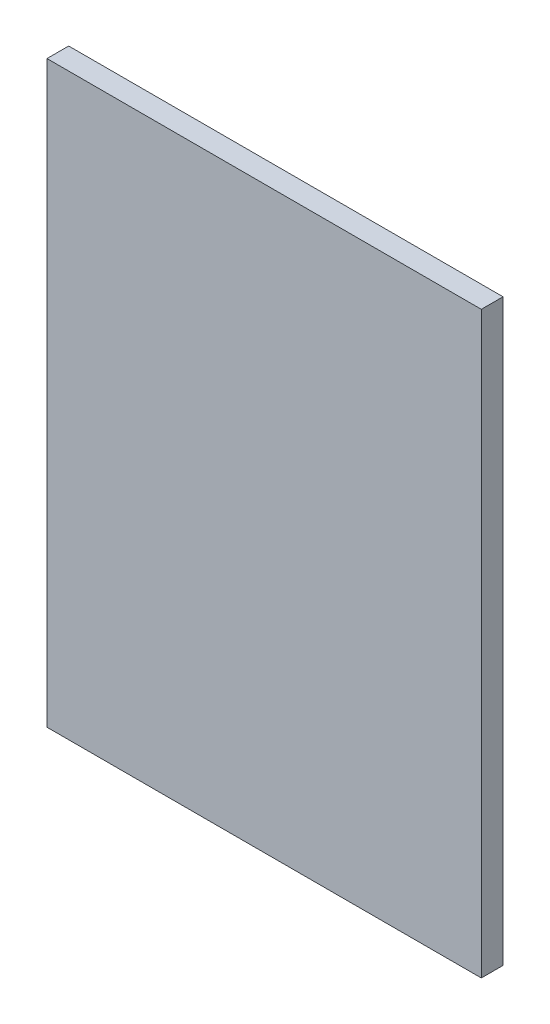
ISO-10303-21;
HEADER;
FILE_DESCRIPTION(('STEP AP214'),'2;1');
FILE_NAME('part.step','',(''),(''),'','','');
FILE_SCHEMA(('AUTOMOTIVE_DESIGN { 1 0 10303 214 1 1 1 1 }'));
ENDSEC;
DATA;
#1=APPLICATION_CONTEXT('core data for automotive mechanical design processes');
#2=APPLICATION_PROTOCOL_DEFINITION('international standard','automotive_design',2000,#1);
#3=PRODUCT_CONTEXT('',#1,'mechanical');
#4=PRODUCT('Part','Part','',(#3));
#5=PRODUCT_RELATED_PRODUCT_CATEGORY('part','',(#4));
#6=PRODUCT_DEFINITION_FORMATION('','',#4);
#7=PRODUCT_DEFINITION_CONTEXT('part definition',#1,'design');
#8=PRODUCT_DEFINITION('design','',#6,#7);
#9=PRODUCT_DEFINITION_SHAPE('','',#8);
#10=(LENGTH_UNIT() NAMED_UNIT(*) SI_UNIT(.MILLI.,.METRE.));
#11=(NAMED_UNIT(*) PLANE_ANGLE_UNIT() SI_UNIT($,.RADIAN.));
#12=(NAMED_UNIT(*) SI_UNIT($,.STERADIAN.) SOLID_ANGLE_UNIT());
#13=UNCERTAINTY_MEASURE_WITH_UNIT(LENGTH_MEASURE(1.E-05),#10,'distance_accuracy_value','');
#14=(GEOMETRIC_REPRESENTATION_CONTEXT(3) GLOBAL_UNCERTAINTY_ASSIGNED_CONTEXT((#13)) GLOBAL_UNIT_ASSIGNED_CONTEXT((#10,
#11,#12)) REPRESENTATION_CONTEXT('',''));
#15=CARTESIAN_POINT('',(0.,0.,0.));
#16=DIRECTION('',(0.,0.,1.));
#17=DIRECTION('',(1.,0.,0.));
#18=AXIS2_PLACEMENT_3D('',#15,#16,#17);
#19=CARTESIAN_POINT('',(0.,0.,3.));
#20=DIRECTION('',(1.,0.,0.));
#21=DIRECTION('',(0.,1.,0.));
#22=AXIS2_PLACEMENT_3D('',#19,#20,#21);
#23=PLANE('',#22);
#24=DIRECTION('',(0.,-1.,0.));
#25=VECTOR('',#24,1.);
#26=CARTESIAN_POINT('',(0.,0.,0.));
#27=LINE('',#26,#25);
#28=CARTESIAN_POINT('',(0.,0.,0.));
#29=VERTEX_POINT('',#28);
#30=CARTESIAN_POINT('',(0.,-80.,0.));
#31=VERTEX_POINT('',#30);
#32=EDGE_CURVE('E111',#29,#31,#27,.T.);
#33=ORIENTED_EDGE('',*,*,#32,.T.);
#34=DIRECTION('',(0.,0.,-1.));
#35=VECTOR('',#34,1.);
#36=CARTESIAN_POINT('',(0.,-80.,3.));
#37=LINE('',#36,#35);
#38=CARTESIAN_POINT('',(0.,-80.,3.));
#39=VERTEX_POINT('',#38);
#40=EDGE_CURVE('E11',#39,#31,#37,.T.);
#41=ORIENTED_EDGE('',*,*,#40,.F.);
#42=DIRECTION('',(0.,-1.,0.));
#43=VECTOR('',#42,1.);
#44=CARTESIAN_POINT('',(0.,0.,3.));
#45=LINE('',#44,#43);
#46=CARTESIAN_POINT('',(0.,0.,3.));
#47=VERTEX_POINT('',#46);
#48=EDGE_CURVE('E95',#47,#39,#45,.T.);
#49=ORIENTED_EDGE('',*,*,#48,.F.);
#50=DIRECTION('',(0.,0.,-1.));
#51=VECTOR('',#50,1.);
#52=CARTESIAN_POINT('',(0.,0.,3.));
#53=LINE('',#52,#51);
#54=EDGE_CURVE('E107',#47,#29,#53,.T.);
#55=ORIENTED_EDGE('',*,*,#54,.T.);
#56=EDGE_LOOP('',(#33,#41,#49,#55));
#57=FACE_BOUND('',#56,.T.);
#58=ADVANCED_FACE('F43',(#57),#23,.F.);
#59=CARTESIAN_POINT('',(0.,-80.,3.));
#60=DIRECTION('',(0.,1.,0.));
#61=DIRECTION('',(0.,0.,1.));
#62=AXIS2_PLACEMENT_3D('',#59,#60,#61);
#63=PLANE('',#62);
#64=DIRECTION('',(1.,0.,0.));
#65=VECTOR('',#64,1.);
#66=CARTESIAN_POINT('',(0.,-80.,0.));
#67=LINE('',#66,#65);
#68=CARTESIAN_POINT('',(60.,-80.,0.));
#69=VERTEX_POINT('',#68);
#70=EDGE_CURVE('E100',#31,#69,#67,.T.);
#71=ORIENTED_EDGE('',*,*,#70,.T.);
#72=DIRECTION('',(0.,0.,-1.));
#73=VECTOR('',#72,1.);
#74=CARTESIAN_POINT('',(60.,-80.,3.));
#75=LINE('',#74,#73);
#76=CARTESIAN_POINT('',(60.,-80.,3.));
#77=VERTEX_POINT('',#76);
#78=EDGE_CURVE('E52',#77,#69,#75,.T.);
#79=ORIENTED_EDGE('',*,*,#78,.F.);
#80=DIRECTION('',(1.,0.,0.));
#81=VECTOR('',#80,1.);
#82=CARTESIAN_POINT('',(0.,-80.,3.));
#83=LINE('',#82,#81);
#84=EDGE_CURVE('E90',#39,#77,#83,.T.);
#85=ORIENTED_EDGE('',*,*,#84,.F.);
#86=ORIENTED_EDGE('',*,*,#40,.T.);
#87=EDGE_LOOP('',(#71,#79,#85,#86));
#88=FACE_BOUND('',#87,.T.);
#89=ADVANCED_FACE('F99',(#88),#63,.F.);
#90=CARTESIAN_POINT('',(60.,0.,3.));
#91=DIRECTION('',(-1.,0.,0.));
#92=DIRECTION('',(0.,-1.,0.));
#93=AXIS2_PLACEMENT_3D('',#90,#91,#92);
#94=PLANE('',#93);
#95=DIRECTION('',(0.,1.,0.));
#96=VECTOR('',#95,1.);
#97=CARTESIAN_POINT('',(60.,0.,0.));
#98=LINE('',#97,#96);
#99=CARTESIAN_POINT('',(60.,0.,0.));
#100=VERTEX_POINT('',#99);
#101=EDGE_CURVE('E77',#69,#100,#98,.T.);
#102=ORIENTED_EDGE('',*,*,#101,.T.);
#103=DIRECTION('',(0.,0.,-1.));
#104=VECTOR('',#103,1.);
#105=CARTESIAN_POINT('',(60.,0.,3.));
#106=LINE('',#105,#104);
#107=CARTESIAN_POINT('',(60.,0.,3.));
#108=VERTEX_POINT('',#107);
#109=EDGE_CURVE('E102',#108,#100,#106,.T.);
#110=ORIENTED_EDGE('',*,*,#109,.F.);
#111=DIRECTION('',(0.,1.,0.));
#112=VECTOR('',#111,1.);
#113=CARTESIAN_POINT('',(60.,0.,3.));
#114=LINE('',#113,#112);
#115=EDGE_CURVE('E93',#77,#108,#114,.T.);
#116=ORIENTED_EDGE('',*,*,#115,.F.);
#117=ORIENTED_EDGE('',*,*,#78,.T.);
#118=EDGE_LOOP('',(#102,#110,#116,#117));
#119=FACE_BOUND('',#118,.T.);
#120=ADVANCED_FACE('F103',(#119),#94,.F.);
#121=CARTESIAN_POINT('',(0.,0.,3.));
#122=DIRECTION('',(0.,-1.,0.));
#123=DIRECTION('',(0.,0.,-1.));
#124=AXIS2_PLACEMENT_3D('',#121,#122,#123);
#125=PLANE('',#124);
#126=DIRECTION('',(-1.,0.,0.));
#127=VECTOR('',#126,1.);
#128=CARTESIAN_POINT('',(0.,0.,0.));
#129=LINE('',#128,#127);
#130=EDGE_CURVE('E83',#100,#29,#129,.T.);
#131=ORIENTED_EDGE('',*,*,#130,.T.);
#132=ORIENTED_EDGE('',*,*,#54,.F.);
#133=DIRECTION('',(-1.,0.,0.));
#134=VECTOR('',#133,1.);
#135=CARTESIAN_POINT('',(0.,0.,3.));
#136=LINE('',#135,#134);
#137=EDGE_CURVE('E60',#108,#47,#136,.T.);
#138=ORIENTED_EDGE('',*,*,#137,.F.);
#139=ORIENTED_EDGE('',*,*,#109,.T.);
#140=EDGE_LOOP('',(#131,#132,#138,#139));
#141=FACE_BOUND('',#140,.T.);
#142=ADVANCED_FACE('F124',(#141),#125,.F.);
#143=CARTESIAN_POINT('',(0.,0.,3.));
#144=DIRECTION('',(0.,0.,1.));
#145=DIRECTION('',(1.,0.,0.));
#146=AXIS2_PLACEMENT_3D('',#143,#144,#145);
#147=PLANE('',#146);
#148=ORIENTED_EDGE('',*,*,#48,.T.);
#149=ORIENTED_EDGE('',*,*,#84,.T.);
#150=ORIENTED_EDGE('',*,*,#115,.T.);
#151=ORIENTED_EDGE('',*,*,#137,.T.);
#152=EDGE_LOOP('',(#148,#149,#150,#151));
#153=FACE_BOUND('',#152,.T.);
#154=ADVANCED_FACE('F91',(#153),#147,.T.);
#155=CARTESIAN_POINT('',(0.,0.,0.));
#156=DIRECTION('',(0.,0.,1.));
#157=DIRECTION('',(1.,0.,0.));
#158=AXIS2_PLACEMENT_3D('',#155,#156,#157);
#159=PLANE('',#158);
#160=ORIENTED_EDGE('',*,*,#32,.F.);
#161=ORIENTED_EDGE('',*,*,#130,.F.);
#162=ORIENTED_EDGE('',*,*,#101,.F.);
#163=ORIENTED_EDGE('',*,*,#70,.F.);
#164=EDGE_LOOP('',(#160,#161,#162,#163));
#165=FACE_BOUND('',#164,.T.);
#166=ADVANCED_FACE('F127',(#165),#159,.F.);
#167=CLOSED_SHELL('',(#58,#89,#120,#142,#154,#166));
#168=MANIFOLD_SOLID_BREP('B2',#167);
#169=ADVANCED_BREP_SHAPE_REPRESENTATION('',(#18,#168),#14);
#170=SHAPE_DEFINITION_REPRESENTATION(#9,#169);
ENDSEC;
END-ISO-10303-21;
